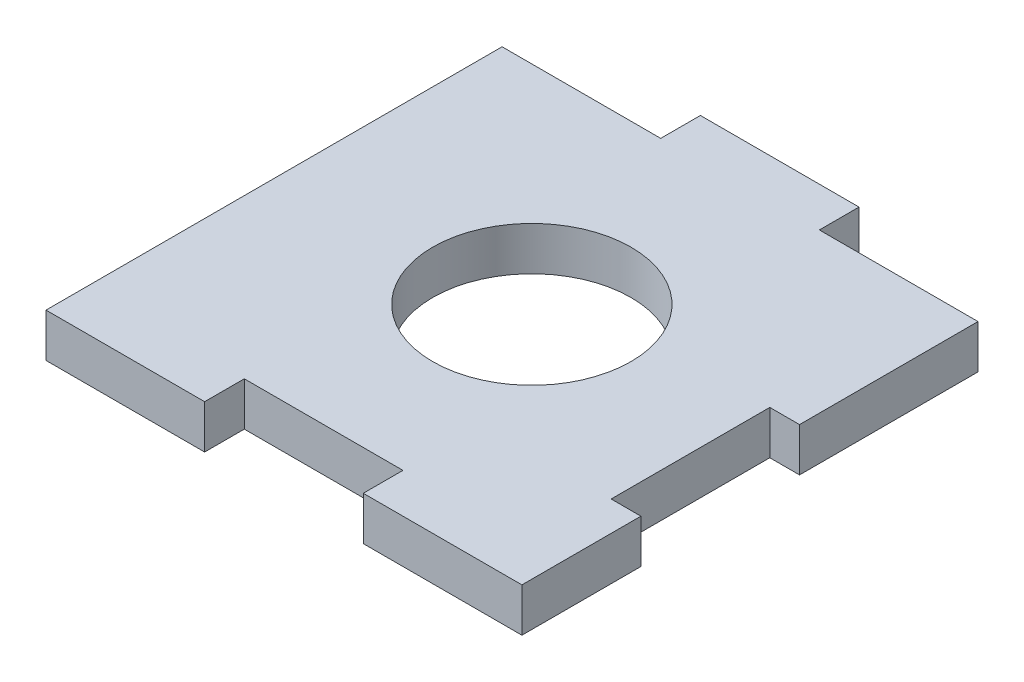
ISO-10303-21;
HEADER;
FILE_DESCRIPTION(('STEP AP214'),'2;1');
FILE_NAME('part.step','',(''),(''),'','','');
FILE_SCHEMA(('AUTOMOTIVE_DESIGN { 1 0 10303 214 1 1 1 1 }'));
ENDSEC;
DATA;
#1=APPLICATION_CONTEXT('core data for automotive mechanical design processes');
#2=APPLICATION_PROTOCOL_DEFINITION('international standard','automotive_design',2000,#1);
#3=PRODUCT_CONTEXT('',#1,'mechanical');
#4=PRODUCT('Part','Part','',(#3));
#5=PRODUCT_RELATED_PRODUCT_CATEGORY('part','',(#4));
#6=PRODUCT_DEFINITION_FORMATION('','',#4);
#7=PRODUCT_DEFINITION_CONTEXT('part definition',#1,'design');
#8=PRODUCT_DEFINITION('design','',#6,#7);
#9=PRODUCT_DEFINITION_SHAPE('','',#8);
#10=(LENGTH_UNIT() NAMED_UNIT(*) SI_UNIT(.MILLI.,.METRE.));
#11=(NAMED_UNIT(*) PLANE_ANGLE_UNIT() SI_UNIT($,.RADIAN.));
#12=(NAMED_UNIT(*) SI_UNIT($,.STERADIAN.) SOLID_ANGLE_UNIT());
#13=UNCERTAINTY_MEASURE_WITH_UNIT(LENGTH_MEASURE(1.E-05),#10,'distance_accuracy_value','');
#14=(GEOMETRIC_REPRESENTATION_CONTEXT(3) GLOBAL_UNCERTAINTY_ASSIGNED_CONTEXT((#13)) GLOBAL_UNIT_ASSIGNED_CONTEXT((#10,
#11,#12)) REPRESENTATION_CONTEXT('',''));
#15=CARTESIAN_POINT('',(0.,0.,0.));
#16=DIRECTION('',(0.,0.,1.));
#17=DIRECTION('',(1.,0.,0.));
#18=AXIS2_PLACEMENT_3D('',#15,#16,#17);
#19=CARTESIAN_POINT('',(-153.195425431338,2.2,0.));
#20=DIRECTION('',(1.,0.,0.));
#21=DIRECTION('',(0.,0.,-1.));
#22=AXIS2_PLACEMENT_3D('',#19,#20,#21);
#23=PLANE('',#22);
#24=DIRECTION('',(0.,0.,1.));
#25=VECTOR('',#24,1.);
#26=CARTESIAN_POINT('',(-153.195425431338,0.,0.));
#27=LINE('',#26,#25);
#28=CARTESIAN_POINT('',(-153.195425431338,0.,34.5977127156645));
#29=VERTEX_POINT('',#28);
#30=CARTESIAN_POINT('',(-153.195425431338,0.,36.5977127156582));
#31=VERTEX_POINT('',#30);
#32=EDGE_CURVE('E182',#29,#31,#27,.T.);
#33=ORIENTED_EDGE('',*,*,#32,.F.);
#34=DIRECTION('',(0.,-1.,0.));
#35=VECTOR('',#34,1.);
#36=CARTESIAN_POINT('',(-153.195425431338,2.2,34.5977127156645));
#37=LINE('',#36,#35);
#38=CARTESIAN_POINT('',(-153.195425431338,2.2,34.5977127156645));
#39=VERTEX_POINT('',#38);
#40=EDGE_CURVE('E11',#39,#29,#37,.T.);
#41=ORIENTED_EDGE('',*,*,#40,.F.);
#42=DIRECTION('',(0.,0.,1.));
#43=VECTOR('',#42,1.);
#44=CARTESIAN_POINT('',(-153.195425431338,2.2,0.));
#45=LINE('',#44,#43);
#46=CARTESIAN_POINT('',(-153.195425431338,2.2,36.5977127156582));
#47=VERTEX_POINT('',#46);
#48=EDGE_CURVE('E274',#39,#47,#45,.T.);
#49=ORIENTED_EDGE('',*,*,#48,.T.);
#50=DIRECTION('',(0.,-1.,0.));
#51=VECTOR('',#50,1.);
#52=CARTESIAN_POINT('',(-153.195425431338,2.2,36.5977127156582));
#53=LINE('',#52,#51);
#54=EDGE_CURVE('E54',#47,#31,#53,.T.);
#55=ORIENTED_EDGE('',*,*,#54,.T.);
#56=EDGE_LOOP('',(#33,#41,#49,#55));
#57=FACE_BOUND('',#56,.T.);
#58=ADVANCED_FACE('F37',(#57),#23,.T.);
#59=CARTESIAN_POINT('',(-4.80139715703752E-13,2.2,34.5977127156666));
#60=DIRECTION('',(0.,0.,1.));
#61=DIRECTION('',(1.,0.,0.));
#62=AXIS2_PLACEMENT_3D('',#59,#60,#61);
#63=PLANE('',#62);
#64=DIRECTION('',(-1.,0.,0.));
#65=VECTOR('',#64,1.);
#66=CARTESIAN_POINT('',(-4.80139715703752E-13,0.,34.5977127156666));
#67=LINE('',#66,#65);
#68=CARTESIAN_POINT('',(-145.195425431338,0.,34.5977127156646));
#69=VERTEX_POINT('',#68);
#70=EDGE_CURVE('E184',#69,#29,#67,.T.);
#71=ORIENTED_EDGE('',*,*,#70,.F.);
#72=DIRECTION('',(0.,-1.,0.));
#73=VECTOR('',#72,1.);
#74=CARTESIAN_POINT('',(-145.195425431338,2.2,34.5977127156646));
#75=LINE('',#74,#73);
#76=CARTESIAN_POINT('',(-145.195425431338,2.2,34.5977127156646));
#77=VERTEX_POINT('',#76);
#78=EDGE_CURVE('E46',#77,#69,#75,.T.);
#79=ORIENTED_EDGE('',*,*,#78,.F.);
#80=DIRECTION('',(-1.,0.,0.));
#81=VECTOR('',#80,1.);
#82=CARTESIAN_POINT('',(-4.80139715703752E-13,2.2,34.5977127156666));
#83=LINE('',#82,#81);
#84=EDGE_CURVE('E271',#77,#39,#83,.T.);
#85=ORIENTED_EDGE('',*,*,#84,.T.);
#86=ORIENTED_EDGE('',*,*,#40,.T.);
#87=EDGE_LOOP('',(#71,#79,#85,#86));
#88=FACE_BOUND('',#87,.T.);
#89=ADVANCED_FACE('F259',(#88),#63,.T.);
#90=CARTESIAN_POINT('',(-145.195425431338,2.2,0.));
#91=DIRECTION('',(-1.,0.,0.));
#92=DIRECTION('',(0.,0.,1.));
#93=AXIS2_PLACEMENT_3D('',#90,#91,#92);
#94=PLANE('',#93);
#95=DIRECTION('',(0.,0.,-1.));
#96=VECTOR('',#95,1.);
#97=CARTESIAN_POINT('',(-145.195425431338,0.,0.));
#98=LINE('',#97,#96);
#99=CARTESIAN_POINT('',(-145.195425431338,0.,36.5977127156582));
#100=VERTEX_POINT('',#99);
#101=EDGE_CURVE('E187',#100,#69,#98,.T.);
#102=ORIENTED_EDGE('',*,*,#101,.F.);
#103=DIRECTION('',(0.,-1.,0.));
#104=VECTOR('',#103,1.);
#105=CARTESIAN_POINT('',(-145.195425431338,2.2,36.5977127156582));
#106=LINE('',#105,#104);
#107=CARTESIAN_POINT('',(-145.195425431338,2.2,36.5977127156582));
#108=VERTEX_POINT('',#107);
#109=EDGE_CURVE('E248',#108,#100,#106,.T.);
#110=ORIENTED_EDGE('',*,*,#109,.F.);
#111=DIRECTION('',(0.,0.,-1.));
#112=VECTOR('',#111,1.);
#113=CARTESIAN_POINT('',(-145.195425431338,2.2,0.));
#114=LINE('',#113,#112);
#115=EDGE_CURVE('E255',#108,#77,#114,.T.);
#116=ORIENTED_EDGE('',*,*,#115,.T.);
#117=ORIENTED_EDGE('',*,*,#78,.T.);
#118=EDGE_LOOP('',(#102,#110,#116,#117));
#119=FACE_BOUND('',#118,.T.);
#120=ADVANCED_FACE('F253',(#119),#94,.T.);
#121=CARTESIAN_POINT('',(0.,2.2,36.5977127156582));
#122=DIRECTION('',(0.,0.,1.));
#123=DIRECTION('',(1.,0.,0.));
#124=AXIS2_PLACEMENT_3D('',#121,#122,#123);
#125=PLANE('',#124);
#126=DIRECTION('',(-1.,0.,0.));
#127=VECTOR('',#126,1.);
#128=CARTESIAN_POINT('',(0.,0.,36.5977127156582));
#129=LINE('',#128,#127);
#130=CARTESIAN_POINT('',(-137.195425431329,0.,36.5977127156582));
#131=VERTEX_POINT('',#130);
#132=EDGE_CURVE('E190',#131,#100,#129,.T.);
#133=ORIENTED_EDGE('',*,*,#132,.F.);
#134=DIRECTION('',(0.,-1.,0.));
#135=VECTOR('',#134,1.);
#136=CARTESIAN_POINT('',(-137.195425431329,2.2,36.5977127156582));
#137=LINE('',#136,#135);
#138=CARTESIAN_POINT('',(-137.195425431329,2.2,36.5977127156582));
#139=VERTEX_POINT('',#138);
#140=EDGE_CURVE('E246',#139,#131,#137,.T.);
#141=ORIENTED_EDGE('',*,*,#140,.F.);
#142=DIRECTION('',(-1.,0.,0.));
#143=VECTOR('',#142,1.);
#144=CARTESIAN_POINT('',(0.,2.2,36.5977127156582));
#145=LINE('',#144,#143);
#146=EDGE_CURVE('E176',#139,#108,#145,.T.);
#147=ORIENTED_EDGE('',*,*,#146,.T.);
#148=ORIENTED_EDGE('',*,*,#109,.T.);
#149=EDGE_LOOP('',(#133,#141,#147,#148));
#150=FACE_BOUND('',#149,.T.);
#151=ADVANCED_FACE('F266',(#150),#125,.T.);
#152=CARTESIAN_POINT('',(-137.195425431329,2.2,0.));
#153=DIRECTION('',(1.,0.,0.));
#154=DIRECTION('',(0.,0.,-1.));
#155=AXIS2_PLACEMENT_3D('',#152,#153,#154);
#156=PLANE('',#155);
#157=DIRECTION('',(0.,0.,1.));
#158=VECTOR('',#157,1.);
#159=CARTESIAN_POINT('',(-137.195425431329,0.,0.));
#160=LINE('',#159,#158);
#161=CARTESIAN_POINT('',(-137.195425431329,0.,30.5977127156648));
#162=VERTEX_POINT('',#161);
#163=EDGE_CURVE('E193',#162,#131,#160,.T.);
#164=ORIENTED_EDGE('',*,*,#163,.F.);
#165=DIRECTION('',(0.,-1.,0.));
#166=VECTOR('',#165,1.);
#167=CARTESIAN_POINT('',(-137.195425431329,2.2,30.5977127156648));
#168=LINE('',#167,#166);
#169=CARTESIAN_POINT('',(-137.195425431329,2.2,30.5977127156648));
#170=VERTEX_POINT('',#169);
#171=EDGE_CURVE('E244',#170,#162,#168,.T.);
#172=ORIENTED_EDGE('',*,*,#171,.F.);
#173=DIRECTION('',(0.,0.,1.));
#174=VECTOR('',#173,1.);
#175=CARTESIAN_POINT('',(-137.195425431329,2.2,0.));
#176=LINE('',#175,#174);
#177=EDGE_CURVE('E273',#170,#139,#176,.T.);
#178=ORIENTED_EDGE('',*,*,#177,.T.);
#179=ORIENTED_EDGE('',*,*,#140,.T.);
#180=EDGE_LOOP('',(#164,#172,#178,#179));
#181=FACE_BOUND('',#180,.T.);
#182=ADVANCED_FACE('F319',(#181),#156,.T.);
#183=CARTESIAN_POINT('',(-1.13234283859342E-12,2.2,30.5977127156698));
#184=DIRECTION('',(0.,0.,1.));
#185=DIRECTION('',(1.,0.,0.));
#186=AXIS2_PLACEMENT_3D('',#183,#184,#185);
#187=PLANE('',#186);
#188=DIRECTION('',(-1.,0.,0.));
#189=VECTOR('',#188,1.);
#190=CARTESIAN_POINT('',(-1.13234283859342E-12,0.,30.5977127156698));
#191=LINE('',#190,#189);
#192=CARTESIAN_POINT('',(-138.695425431338,0.,30.5977127156647));
#193=VERTEX_POINT('',#192);
#194=EDGE_CURVE('E197',#162,#193,#191,.T.);
#195=ORIENTED_EDGE('',*,*,#194,.T.);
#196=DIRECTION('',(0.,-1.,0.));
#197=VECTOR('',#196,1.);
#198=CARTESIAN_POINT('',(-138.695425431338,2.2,30.5977127156647));
#199=LINE('',#198,#197);
#200=CARTESIAN_POINT('',(-138.695425431338,2.2,30.5977127156647));
#201=VERTEX_POINT('',#200);
#202=EDGE_CURVE('E241',#201,#193,#199,.T.);
#203=ORIENTED_EDGE('',*,*,#202,.F.);
#204=DIRECTION('',(-1.,0.,0.));
#205=VECTOR('',#204,1.);
#206=CARTESIAN_POINT('',(-1.13234283859342E-12,2.2,30.5977127156698));
#207=LINE('',#206,#205);
#208=EDGE_CURVE('E279',#170,#201,#207,.T.);
#209=ORIENTED_EDGE('',*,*,#208,.F.);
#210=ORIENTED_EDGE('',*,*,#171,.T.);
#211=EDGE_LOOP('',(#195,#203,#209,#210));
#212=FACE_BOUND('',#211,.T.);
#213=ADVANCED_FACE('F328',(#212),#187,.F.);
#214=CARTESIAN_POINT('',(-138.695425431338,2.2,0.));
#215=DIRECTION('',(-1.,0.,0.));
#216=DIRECTION('',(0.,0.,1.));
#217=AXIS2_PLACEMENT_3D('',#214,#215,#216);
#218=PLANE('',#217);
#219=DIRECTION('',(0.,0.,-1.));
#220=VECTOR('',#219,1.);
#221=CARTESIAN_POINT('',(-138.695425431338,0.,0.));
#222=LINE('',#221,#220);
#223=CARTESIAN_POINT('',(-138.695425431338,0.,22.5977127156647));
#224=VERTEX_POINT('',#223);
#225=EDGE_CURVE('E201',#193,#224,#222,.T.);
#226=ORIENTED_EDGE('',*,*,#225,.T.);
#227=DIRECTION('',(0.,-1.,0.));
#228=VECTOR('',#227,1.);
#229=CARTESIAN_POINT('',(-138.695425431338,2.2,22.5977127156647));
#230=LINE('',#229,#228);
#231=CARTESIAN_POINT('',(-138.695425431338,2.2,22.5977127156647));
#232=VERTEX_POINT('',#231);
#233=EDGE_CURVE('E238',#232,#224,#230,.T.);
#234=ORIENTED_EDGE('',*,*,#233,.F.);
#235=DIRECTION('',(0.,0.,-1.));
#236=VECTOR('',#235,1.);
#237=CARTESIAN_POINT('',(-138.695425431338,2.2,0.));
#238=LINE('',#237,#236);
#239=EDGE_CURVE('E283',#201,#232,#238,.T.);
#240=ORIENTED_EDGE('',*,*,#239,.F.);
#241=ORIENTED_EDGE('',*,*,#202,.T.);
#242=EDGE_LOOP('',(#226,#234,#240,#241));
#243=FACE_BOUND('',#242,.T.);
#244=ADVANCED_FACE('F331',(#243),#218,.F.);
#245=CARTESIAN_POINT('',(-8.36283365360012E-13,2.2,22.5977127156698));
#246=DIRECTION('',(0.,0.,-1.));
#247=DIRECTION('',(-1.,0.,0.));
#248=AXIS2_PLACEMENT_3D('',#245,#246,#247);
#249=PLANE('',#248);
#250=DIRECTION('',(1.,0.,0.));
#251=VECTOR('',#250,1.);
#252=CARTESIAN_POINT('',(-8.36283365360012E-13,0.,22.5977127156698));
#253=LINE('',#252,#251);
#254=CARTESIAN_POINT('',(-137.195425431329,0.,22.5977127156648));
#255=VERTEX_POINT('',#254);
#256=EDGE_CURVE('E204',#224,#255,#253,.T.);
#257=ORIENTED_EDGE('',*,*,#256,.T.);
#258=DIRECTION('',(0.,-1.,0.));
#259=VECTOR('',#258,1.);
#260=CARTESIAN_POINT('',(-137.195425431329,2.2,22.5977127156648));
#261=LINE('',#260,#259);
#262=CARTESIAN_POINT('',(-137.195425431329,2.2,22.5977127156648));
#263=VERTEX_POINT('',#262);
#264=EDGE_CURVE('E236',#263,#255,#261,.T.);
#265=ORIENTED_EDGE('',*,*,#264,.F.);
#266=DIRECTION('',(1.,0.,0.));
#267=VECTOR('',#266,1.);
#268=CARTESIAN_POINT('',(-8.36283365360012E-13,2.2,22.5977127156698));
#269=LINE('',#268,#267);
#270=EDGE_CURVE('E286',#232,#263,#269,.T.);
#271=ORIENTED_EDGE('',*,*,#270,.F.);
#272=ORIENTED_EDGE('',*,*,#233,.T.);
#273=EDGE_LOOP('',(#257,#265,#271,#272));
#274=FACE_BOUND('',#273,.T.);
#275=ADVANCED_FACE('F335',(#274),#249,.F.);
#276=CARTESIAN_POINT('',(-137.195425431329,0.,13.5977127156646));
#277=VERTEX_POINT('',#276);
#278=EDGE_CURVE('E198',#277,#255,#160,.T.);
#279=ORIENTED_EDGE('',*,*,#278,.F.);
#280=DIRECTION('',(0.,-1.,0.));
#281=VECTOR('',#280,1.);
#282=CARTESIAN_POINT('',(-137.195425431329,2.2,13.5977127156646));
#283=LINE('',#282,#281);
#284=CARTESIAN_POINT('',(-137.195425431329,2.2,13.5977127156646));
#285=VERTEX_POINT('',#284);
#286=EDGE_CURVE('E234',#285,#277,#283,.T.);
#287=ORIENTED_EDGE('',*,*,#286,.F.);
#288=EDGE_CURVE('E280',#285,#263,#176,.T.);
#289=ORIENTED_EDGE('',*,*,#288,.T.);
#290=ORIENTED_EDGE('',*,*,#264,.T.);
#291=EDGE_LOOP('',(#279,#287,#289,#290));
#292=FACE_BOUND('',#291,.T.);
#293=ADVANCED_FACE('F339',(#292),#156,.T.);
#294=CARTESIAN_POINT('',(-1.88706171739641E-13,2.2,13.5977127156666));
#295=DIRECTION('',(0.,0.,1.));
#296=DIRECTION('',(1.,0.,0.));
#297=AXIS2_PLACEMENT_3D('',#294,#295,#296);
#298=PLANE('',#297);
#299=DIRECTION('',(-1.,0.,0.));
#300=VECTOR('',#299,1.);
#301=CARTESIAN_POINT('',(-1.88706171739641E-13,0.,13.5977127156666));
#302=LINE('',#301,#300);
#303=CARTESIAN_POINT('',(-145.195425431337,0.,13.5977127156646));
#304=VERTEX_POINT('',#303);
#305=EDGE_CURVE('E207',#277,#304,#302,.T.);
#306=ORIENTED_EDGE('',*,*,#305,.T.);
#307=DIRECTION('',(0.,-1.,0.));
#308=VECTOR('',#307,1.);
#309=CARTESIAN_POINT('',(-145.195425431337,2.2,13.5977127156646));
#310=LINE('',#309,#308);
#311=CARTESIAN_POINT('',(-145.195425431337,2.2,13.5977127156646));
#312=VERTEX_POINT('',#311);
#313=EDGE_CURVE('E231',#312,#304,#310,.T.);
#314=ORIENTED_EDGE('',*,*,#313,.F.);
#315=DIRECTION('',(-1.,0.,0.));
#316=VECTOR('',#315,1.);
#317=CARTESIAN_POINT('',(-1.88706171739641E-13,2.2,13.5977127156666));
#318=LINE('',#317,#316);
#319=EDGE_CURVE('E288',#285,#312,#318,.T.);
#320=ORIENTED_EDGE('',*,*,#319,.F.);
#321=ORIENTED_EDGE('',*,*,#286,.T.);
#322=EDGE_LOOP('',(#306,#314,#320,#321));
#323=FACE_BOUND('',#322,.T.);
#324=ADVANCED_FACE('F343',(#323),#298,.F.);
#325=CARTESIAN_POINT('',(-145.195425431337,2.2,-4.02998260960288E-12));
#326=DIRECTION('',(-1.,0.,0.));
#327=DIRECTION('',(0.,0.,1.));
#328=AXIS2_PLACEMENT_3D('',#325,#326,#327);
#329=PLANE('',#328);
#330=DIRECTION('',(0.,0.,-1.));
#331=VECTOR('',#330,1.);
#332=CARTESIAN_POINT('',(-145.195425431337,0.,-4.02998260960288E-12));
#333=LINE('',#332,#331);
#334=CARTESIAN_POINT('',(-145.195425431337,0.,11.5977127156733));
#335=VERTEX_POINT('',#334);
#336=EDGE_CURVE('E210',#304,#335,#333,.T.);
#337=ORIENTED_EDGE('',*,*,#336,.T.);
#338=DIRECTION('',(0.,-1.,0.));
#339=VECTOR('',#338,1.);
#340=CARTESIAN_POINT('',(-145.195425431337,2.2,11.5977127156733));
#341=LINE('',#340,#339);
#342=CARTESIAN_POINT('',(-145.195425431337,2.2,11.5977127156733));
#343=VERTEX_POINT('',#342);
#344=EDGE_CURVE('E228',#343,#335,#341,.T.);
#345=ORIENTED_EDGE('',*,*,#344,.F.);
#346=DIRECTION('',(0.,0.,-1.));
#347=VECTOR('',#346,1.);
#348=CARTESIAN_POINT('',(-145.195425431337,2.2,-4.02998260960288E-12));
#349=LINE('',#348,#347);
#350=EDGE_CURVE('E291',#312,#343,#349,.T.);
#351=ORIENTED_EDGE('',*,*,#350,.F.);
#352=ORIENTED_EDGE('',*,*,#313,.T.);
#353=EDGE_LOOP('',(#337,#345,#351,#352));
#354=FACE_BOUND('',#353,.T.);
#355=ADVANCED_FACE('F347',(#354),#329,.F.);
#356=CARTESIAN_POINT('',(0.,2.2,11.5977127156733));
#357=DIRECTION('',(0.,0.,1.));
#358=DIRECTION('',(1.,0.,0.));
#359=AXIS2_PLACEMENT_3D('',#356,#357,#358);
#360=PLANE('',#359);
#361=DIRECTION('',(-1.,0.,0.));
#362=VECTOR('',#361,1.);
#363=CARTESIAN_POINT('',(0.,0.,11.5977127156733));
#364=LINE('',#363,#362);
#365=CARTESIAN_POINT('',(-153.195425431337,0.,11.5977127156733));
#366=VERTEX_POINT('',#365);
#367=EDGE_CURVE('E213',#335,#366,#364,.T.);
#368=ORIENTED_EDGE('',*,*,#367,.T.);
#369=DIRECTION('',(0.,-1.,0.));
#370=VECTOR('',#369,1.);
#371=CARTESIAN_POINT('',(-153.195425431337,2.2,11.5977127156733));
#372=LINE('',#371,#370);
#373=CARTESIAN_POINT('',(-153.195425431337,2.2,11.5977127156733));
#374=VERTEX_POINT('',#373);
#375=EDGE_CURVE('E225',#374,#366,#372,.T.);
#376=ORIENTED_EDGE('',*,*,#375,.F.);
#377=DIRECTION('',(-1.,0.,0.));
#378=VECTOR('',#377,1.);
#379=CARTESIAN_POINT('',(0.,2.2,11.5977127156733));
#380=LINE('',#379,#378);
#381=EDGE_CURVE('E294',#343,#374,#380,.T.);
#382=ORIENTED_EDGE('',*,*,#381,.F.);
#383=ORIENTED_EDGE('',*,*,#344,.T.);
#384=EDGE_LOOP('',(#368,#376,#382,#383));
#385=FACE_BOUND('',#384,.T.);
#386=ADVANCED_FACE('F298',(#385),#360,.F.);
#387=CARTESIAN_POINT('',(-153.195425431337,2.2,-4.25202721452797E-12));
#388=DIRECTION('',(1.,0.,0.));
#389=DIRECTION('',(0.,0.,-1.));
#390=AXIS2_PLACEMENT_3D('',#387,#388,#389);
#391=PLANE('',#390);
#392=DIRECTION('',(0.,0.,1.));
#393=VECTOR('',#392,1.);
#394=CARTESIAN_POINT('',(-153.195425431337,0.,-4.25202721452797E-12));
#395=LINE('',#394,#393);
#396=CARTESIAN_POINT('',(-153.195425431337,0.,13.5977127156644));
#397=VERTEX_POINT('',#396);
#398=EDGE_CURVE('E216',#366,#397,#395,.T.);
#399=ORIENTED_EDGE('',*,*,#398,.T.);
#400=DIRECTION('',(0.,-1.,0.));
#401=VECTOR('',#400,1.);
#402=CARTESIAN_POINT('',(-153.195425431337,2.2,13.5977127156644));
#403=LINE('',#402,#401);
#404=CARTESIAN_POINT('',(-153.195425431337,2.2,13.5977127156644));
#405=VERTEX_POINT('',#404);
#406=EDGE_CURVE('E170',#405,#397,#403,.T.);
#407=ORIENTED_EDGE('',*,*,#406,.F.);
#408=DIRECTION('',(0.,0.,1.));
#409=VECTOR('',#408,1.);
#410=CARTESIAN_POINT('',(-153.195425431337,2.2,-4.25202721452797E-12));
#411=LINE('',#410,#409);
#412=EDGE_CURVE('E159',#374,#405,#411,.T.);
#413=ORIENTED_EDGE('',*,*,#412,.F.);
#414=ORIENTED_EDGE('',*,*,#375,.T.);
#415=EDGE_LOOP('',(#399,#407,#413,#414));
#416=FACE_BOUND('',#415,.T.);
#417=ADVANCED_FACE('F300',(#416),#391,.F.);
#418=CARTESIAN_POINT('',(0.,2.2,13.5977127156655));
#419=DIRECTION('',(0.,0.,1.));
#420=DIRECTION('',(1.,0.,0.));
#421=AXIS2_PLACEMENT_3D('',#418,#419,#420);
#422=PLANE('',#421);
#423=DIRECTION('',(-1.,0.,0.));
#424=VECTOR('',#423,1.);
#425=CARTESIAN_POINT('',(0.,0.,13.5977127156655));
#426=LINE('',#425,#424);
#427=CARTESIAN_POINT('',(-161.195425431344,0.,13.5977127156644));
#428=VERTEX_POINT('',#427);
#429=EDGE_CURVE('E167',#397,#428,#426,.T.);
#430=ORIENTED_EDGE('',*,*,#429,.T.);
#431=DIRECTION('',(0.,-1.,0.));
#432=VECTOR('',#431,1.);
#433=CARTESIAN_POINT('',(-161.195425431344,2.2,13.5977127156644));
#434=LINE('',#433,#432);
#435=CARTESIAN_POINT('',(-161.195425431344,2.2,13.5977127156644));
#436=VERTEX_POINT('',#435);
#437=EDGE_CURVE('E165',#436,#428,#434,.T.);
#438=ORIENTED_EDGE('',*,*,#437,.F.);
#439=DIRECTION('',(-1.,0.,0.));
#440=VECTOR('',#439,1.);
#441=CARTESIAN_POINT('',(0.,2.2,13.5977127156655));
#442=LINE('',#441,#440);
#443=EDGE_CURVE('E152',#405,#436,#442,.T.);
#444=ORIENTED_EDGE('',*,*,#443,.F.);
#445=ORIENTED_EDGE('',*,*,#406,.T.);
#446=EDGE_LOOP('',(#430,#438,#444,#445));
#447=FACE_BOUND('',#446,.T.);
#448=ADVANCED_FACE('F166',(#447),#422,.F.);
#449=CARTESIAN_POINT('',(-161.195425431344,2.2,0.));
#450=DIRECTION('',(-1.,0.,0.));
#451=DIRECTION('',(0.,0.,1.));
#452=AXIS2_PLACEMENT_3D('',#449,#450,#451);
#453=PLANE('',#452);
#454=DIRECTION('',(0.,0.,-1.));
#455=VECTOR('',#454,1.);
#456=CARTESIAN_POINT('',(-161.195425431344,0.,0.));
#457=LINE('',#456,#455);
#458=CARTESIAN_POINT('',(-161.195425431344,0.,36.5977127156582));
#459=VERTEX_POINT('',#458);
#460=EDGE_CURVE('E220',#459,#428,#457,.T.);
#461=ORIENTED_EDGE('',*,*,#460,.F.);
#462=DIRECTION('',(0.,-1.,0.));
#463=VECTOR('',#462,1.);
#464=CARTESIAN_POINT('',(-161.195425431344,2.2,36.5977127156582));
#465=LINE('',#464,#463);
#466=CARTESIAN_POINT('',(-161.195425431344,2.2,36.5977127156582));
#467=VERTEX_POINT('',#466);
#468=EDGE_CURVE('E103',#467,#459,#465,.T.);
#469=ORIENTED_EDGE('',*,*,#468,.F.);
#470=DIRECTION('',(0.,0.,-1.));
#471=VECTOR('',#470,1.);
#472=CARTESIAN_POINT('',(-161.195425431344,2.2,0.));
#473=LINE('',#472,#471);
#474=EDGE_CURVE('E157',#467,#436,#473,.T.);
#475=ORIENTED_EDGE('',*,*,#474,.T.);
#476=ORIENTED_EDGE('',*,*,#437,.T.);
#477=EDGE_LOOP('',(#461,#469,#475,#476));
#478=FACE_BOUND('',#477,.T.);
#479=ADVANCED_FACE('F172',(#478),#453,.T.);
#480=CARTESIAN_POINT('',(-149.195425431327,2.2,24.0977127156743));
#481=DIRECTION('',(0.,-1.,0.));
#482=DIRECTION('',(0.,0.,-1.));
#483=AXIS2_PLACEMENT_3D('',#480,#481,#482);
#484=CYLINDRICAL_SURFACE('',#483,4.99999999999991);
#485=CARTESIAN_POINT('',(-149.195425431327,2.2,24.0977127156743));
#486=DIRECTION('',(0.,1.,0.));
#487=DIRECTION('',(0.,0.,1.));
#488=AXIS2_PLACEMENT_3D('',#485,#486,#487);
#489=CIRCLE('',#488,4.99999999999991);
#490=CARTESIAN_POINT('',(-149.195425431327,2.2,29.0977127156742));
#491=VERTEX_POINT('',#490);
#492=EDGE_CURVE('E302',#491,#491,#489,.T.);
#493=ORIENTED_EDGE('',*,*,#492,.T.);
#494=EDGE_LOOP('',(#493));
#495=FACE_BOUND('',#494,.T.);
#496=CARTESIAN_POINT('',(-149.195425431327,0.,24.0977127156743));
#497=DIRECTION('',(0.,1.,0.));
#498=DIRECTION('',(0.,0.,1.));
#499=AXIS2_PLACEMENT_3D('',#496,#497,#498);
#500=CIRCLE('',#499,4.99999999999991);
#501=CARTESIAN_POINT('',(-149.195425431327,0.,29.0977127156742));
#502=VERTEX_POINT('',#501);
#503=EDGE_CURVE('E179',#502,#502,#500,.T.);
#504=ORIENTED_EDGE('',*,*,#503,.F.);
#505=EDGE_LOOP('',(#504));
#506=FACE_BOUND('',#505,.T.);
#507=ADVANCED_FACE('F39',(#495,#506),#484,.F.);
#508=EDGE_CURVE('E194',#31,#459,#129,.T.);
#509=ORIENTED_EDGE('',*,*,#508,.F.);
#510=ORIENTED_EDGE('',*,*,#54,.F.);
#511=EDGE_CURVE('E173',#47,#467,#145,.T.);
#512=ORIENTED_EDGE('',*,*,#511,.T.);
#513=ORIENTED_EDGE('',*,*,#468,.T.);
#514=EDGE_LOOP('',(#509,#510,#512,#513));
#515=FACE_BOUND('',#514,.T.);
#516=ADVANCED_FACE('F307',(#515),#125,.T.);
#517=CARTESIAN_POINT('',(0.,2.2,0.));
#518=DIRECTION('',(0.,1.,0.));
#519=DIRECTION('',(0.,0.,1.));
#520=AXIS2_PLACEMENT_3D('',#517,#518,#519);
#521=PLANE('',#520);
#522=ORIENTED_EDGE('',*,*,#492,.F.);
#523=EDGE_LOOP('',(#522));
#524=FACE_BOUND('',#523,.T.);
#525=ORIENTED_EDGE('',*,*,#48,.F.);
#526=ORIENTED_EDGE('',*,*,#84,.F.);
#527=ORIENTED_EDGE('',*,*,#115,.F.);
#528=ORIENTED_EDGE('',*,*,#146,.F.);
#529=ORIENTED_EDGE('',*,*,#177,.F.);
#530=ORIENTED_EDGE('',*,*,#208,.T.);
#531=ORIENTED_EDGE('',*,*,#239,.T.);
#532=ORIENTED_EDGE('',*,*,#270,.T.);
#533=ORIENTED_EDGE('',*,*,#288,.F.);
#534=ORIENTED_EDGE('',*,*,#319,.T.);
#535=ORIENTED_EDGE('',*,*,#350,.T.);
#536=ORIENTED_EDGE('',*,*,#381,.T.);
#537=ORIENTED_EDGE('',*,*,#412,.T.);
#538=ORIENTED_EDGE('',*,*,#443,.T.);
#539=ORIENTED_EDGE('',*,*,#474,.F.);
#540=ORIENTED_EDGE('',*,*,#511,.F.);
#541=EDGE_LOOP('',(#525,#526,#527,#528,#529,#530,#531,#532,#533,#534,#535,#536,#537,#538,#539,#540));
#542=FACE_BOUND('',#541,.T.);
#543=ADVANCED_FACE('F154',(#524,#542),#521,.T.);
#544=CARTESIAN_POINT('',(0.,0.,0.));
#545=DIRECTION('',(0.,1.,0.));
#546=DIRECTION('',(0.,0.,1.));
#547=AXIS2_PLACEMENT_3D('',#544,#545,#546);
#548=PLANE('',#547);
#549=ORIENTED_EDGE('',*,*,#503,.T.);
#550=EDGE_LOOP('',(#549));
#551=FACE_BOUND('',#550,.T.);
#552=ORIENTED_EDGE('',*,*,#32,.T.);
#553=ORIENTED_EDGE('',*,*,#508,.T.);
#554=ORIENTED_EDGE('',*,*,#460,.T.);
#555=ORIENTED_EDGE('',*,*,#429,.F.);
#556=ORIENTED_EDGE('',*,*,#398,.F.);
#557=ORIENTED_EDGE('',*,*,#367,.F.);
#558=ORIENTED_EDGE('',*,*,#336,.F.);
#559=ORIENTED_EDGE('',*,*,#305,.F.);
#560=ORIENTED_EDGE('',*,*,#278,.T.);
#561=ORIENTED_EDGE('',*,*,#256,.F.);
#562=ORIENTED_EDGE('',*,*,#225,.F.);
#563=ORIENTED_EDGE('',*,*,#194,.F.);
#564=ORIENTED_EDGE('',*,*,#163,.T.);
#565=ORIENTED_EDGE('',*,*,#132,.T.);
#566=ORIENTED_EDGE('',*,*,#101,.T.);
#567=ORIENTED_EDGE('',*,*,#70,.T.);
#568=EDGE_LOOP('',(#552,#553,#554,#555,#556,#557,#558,#559,#560,#561,#562,#563,#564,#565,#566,#567));
#569=FACE_BOUND('',#568,.T.);
#570=ADVANCED_FACE('F261',(#551,#569),#548,.F.);
#571=CLOSED_SHELL('',(#58,#89,#120,#151,#182,#213,#244,#275,#293,#324,#355,#386,#417,#448,#479,
#507,#516,#543,#570));
#572=MANIFOLD_SOLID_BREP('B2',#571);
#573=ADVANCED_BREP_SHAPE_REPRESENTATION('',(#18,#572),#14);
#574=SHAPE_DEFINITION_REPRESENTATION(#9,#573);
ENDSEC;
END-ISO-10303-21;
